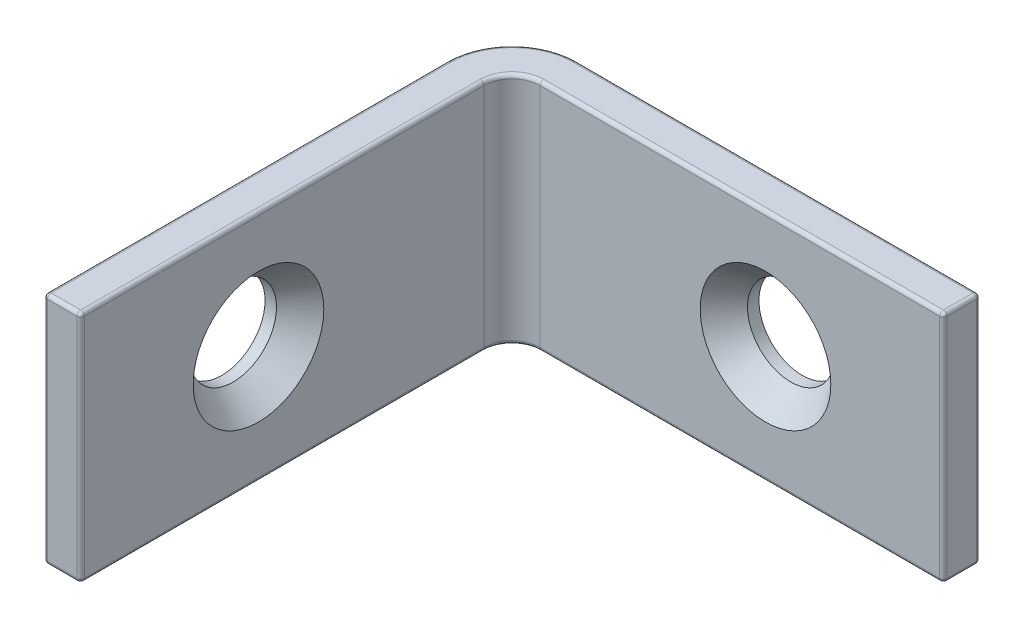
ISO-10303-21;
HEADER;
FILE_DESCRIPTION(('STEP AP214'),'2;1');
FILE_NAME('part.step','',(''),(''),'','','');
FILE_SCHEMA(('AUTOMOTIVE_DESIGN { 1 0 10303 214 1 1 1 1 }'));
ENDSEC;
DATA;
#1=APPLICATION_CONTEXT('core data for automotive mechanical design processes');
#2=APPLICATION_PROTOCOL_DEFINITION('international standard','automotive_design',2000,#1);
#3=PRODUCT_CONTEXT('',#1,'mechanical');
#4=PRODUCT('Part','Part','',(#3));
#5=PRODUCT_RELATED_PRODUCT_CATEGORY('part','',(#4));
#6=PRODUCT_DEFINITION_FORMATION('','',#4);
#7=PRODUCT_DEFINITION_CONTEXT('part definition',#1,'design');
#8=PRODUCT_DEFINITION('design','',#6,#7);
#9=PRODUCT_DEFINITION_SHAPE('','',#8);
#10=(LENGTH_UNIT() NAMED_UNIT(*) SI_UNIT(.MILLI.,.METRE.));
#11=(NAMED_UNIT(*) PLANE_ANGLE_UNIT() SI_UNIT($,.RADIAN.));
#12=(NAMED_UNIT(*) SI_UNIT($,.STERADIAN.) SOLID_ANGLE_UNIT());
#13=UNCERTAINTY_MEASURE_WITH_UNIT(LENGTH_MEASURE(1.E-05),#10,'distance_accuracy_value','');
#14=(GEOMETRIC_REPRESENTATION_CONTEXT(3) GLOBAL_UNCERTAINTY_ASSIGNED_CONTEXT((#13)) GLOBAL_UNIT_ASSIGNED_CONTEXT((#10,
#11,#12)) REPRESENTATION_CONTEXT('',''));
#15=CARTESIAN_POINT('',(0.,0.,0.));
#16=DIRECTION('',(0.,0.,1.));
#17=DIRECTION('',(1.,0.,0.));
#18=AXIS2_PLACEMENT_3D('',#15,#16,#17);
#19=CARTESIAN_POINT('',(-0.996949999999999,6.35,24.40305));
#20=DIRECTION('',(1.,0.,0.));
#21=DIRECTION('',(0.,0.,-1.));
#22=AXIS2_PLACEMENT_3D('',#19,#20,#21);
#23=PLANE('',#22);
#24=CARTESIAN_POINT('',(-0.996949999999999,0.,14.75105));
#25=DIRECTION('',(1.,0.,0.));
#26=DIRECTION('',(0.,0.,-1.));
#27=AXIS2_PLACEMENT_3D('',#24,#25,#26);
#28=CIRCLE('',#27,2.3495);
#29=CARTESIAN_POINT('',(-0.996949999999999,0.,12.40155));
#30=VERTEX_POINT('',#29);
#31=EDGE_CURVE('E1208',#30,#30,#28,.F.);
#32=ORIENTED_EDGE('',*,*,#31,.F.);
#33=EDGE_LOOP('',(#32));
#34=FACE_BOUND('',#33,.T.);
#35=DIRECTION('',(0.,-1.,0.));
#36=VECTOR('',#35,1.);
#37=CARTESIAN_POINT('',(-0.996949999999999,6.35,2.52095));
#38=LINE('',#37,#36);
#39=CARTESIAN_POINT('',(-0.996949999999999,6.15061,2.52095));
#40=VERTEX_POINT('',#39);
#41=CARTESIAN_POINT('',(-0.996949999999999,-6.15061,2.52095));
#42=VERTEX_POINT('',#41);
#43=EDGE_CURVE('E972',#40,#42,#38,.T.);
#44=ORIENTED_EDGE('',*,*,#43,.T.);
#45=DIRECTION('',(0.,0.,1.));
#46=VECTOR('',#45,1.);
#47=CARTESIAN_POINT('',(-0.996949999999999,-6.15061,24.40305));
#48=LINE('',#47,#46);
#49=CARTESIAN_POINT('',(-0.996949999999999,-6.15061,24.20366));
#50=VERTEX_POINT('',#49);
#51=EDGE_CURVE('E1019',#42,#50,#48,.T.);
#52=ORIENTED_EDGE('',*,*,#51,.T.);
#53=DIRECTION('',(0.,-1.,0.));
#54=VECTOR('',#53,1.);
#55=CARTESIAN_POINT('',(-0.996949999999999,6.35,24.20366));
#56=LINE('',#55,#54);
#57=CARTESIAN_POINT('',(-0.996949999999999,6.15061,24.20366));
#58=VERTEX_POINT('',#57);
#59=EDGE_CURVE('E1016',#50,#58,#56,.F.);
#60=ORIENTED_EDGE('',*,*,#59,.T.);
#61=DIRECTION('',(0.,0.,1.));
#62=VECTOR('',#61,1.);
#63=CARTESIAN_POINT('',(-0.996949999999999,6.15061,24.40305));
#64=LINE('',#63,#62);
#65=EDGE_CURVE('E1013',#58,#40,#64,.F.);
#66=ORIENTED_EDGE('',*,*,#65,.T.);
#67=EDGE_LOOP('',(#44,#52,#60,#66));
#68=FACE_BOUND('',#67,.T.);
#69=ADVANCED_FACE('F789',(#34,#68),#23,.F.);
#70=CARTESIAN_POINT('',(0.996949999999999,6.35,24.40305));
#71=DIRECTION('',(0.,0.,-1.));
#72=DIRECTION('',(-1.,0.,0.));
#73=AXIS2_PLACEMENT_3D('',#70,#71,#72);
#74=PLANE('',#73);
#75=DIRECTION('',(0.,-1.,0.));
#76=VECTOR('',#75,1.);
#77=CARTESIAN_POINT('',(-0.797559999999999,6.35,24.40305));
#78=LINE('',#77,#76);
#79=CARTESIAN_POINT('',(-0.797559999999999,6.15061,24.40305));
#80=VERTEX_POINT('',#79);
#81=CARTESIAN_POINT('',(-0.797559999999999,-6.15061,24.40305));
#82=VERTEX_POINT('',#81);
#83=EDGE_CURVE('E1006',#80,#82,#78,.T.);
#84=ORIENTED_EDGE('',*,*,#83,.T.);
#85=DIRECTION('',(1.,0.,0.));
#86=VECTOR('',#85,1.);
#87=CARTESIAN_POINT('',(0.996949999999999,-6.15061,24.40305));
#88=LINE('',#87,#86);
#89=CARTESIAN_POINT('',(0.797559999999998,-6.15061,24.40305));
#90=VERTEX_POINT('',#89);
#91=EDGE_CURVE('E1010',#82,#90,#88,.T.);
#92=ORIENTED_EDGE('',*,*,#91,.T.);
#93=DIRECTION('',(0.,-1.,0.));
#94=VECTOR('',#93,1.);
#95=CARTESIAN_POINT('',(0.797559999999998,6.35,24.40305));
#96=LINE('',#95,#94);
#97=CARTESIAN_POINT('',(0.797559999999998,6.15061,24.40305));
#98=VERTEX_POINT('',#97);
#99=EDGE_CURVE('E1003',#90,#98,#96,.F.);
#100=ORIENTED_EDGE('',*,*,#99,.T.);
#101=DIRECTION('',(1.,0.,0.));
#102=VECTOR('',#101,1.);
#103=CARTESIAN_POINT('',(0.996949999999999,6.15061,24.40305));
#104=LINE('',#103,#102);
#105=EDGE_CURVE('E1000',#98,#80,#104,.F.);
#106=ORIENTED_EDGE('',*,*,#105,.T.);
#107=EDGE_LOOP('',(#84,#92,#100,#106));
#108=FACE_BOUND('',#107,.T.);
#109=ADVANCED_FACE('F1254',(#108),#74,.F.);
#110=CARTESIAN_POINT('',(0.996949999999984,6.35,0.996950000000008));
#111=DIRECTION('',(-1.,0.,0.));
#112=DIRECTION('',(0.,0.,1.));
#113=AXIS2_PLACEMENT_3D('',#110,#111,#112);
#114=PLANE('',#113);
#115=CARTESIAN_POINT('',(0.996949999999992,0.,14.75105));
#116=DIRECTION('',(1.,0.,0.));
#117=DIRECTION('',(0.,0.,-1.));
#118=AXIS2_PLACEMENT_3D('',#115,#116,#117);
#119=CIRCLE('',#118,3.5433);
#120=CARTESIAN_POINT('',(0.99694999999999,0.,11.20775));
#121=VERTEX_POINT('',#120);
#122=EDGE_CURVE('E1196',#121,#121,#119,.T.);
#123=ORIENTED_EDGE('',*,*,#122,.F.);
#124=EDGE_LOOP('',(#123));
#125=FACE_BOUND('',#124,.T.);
#126=DIRECTION('',(0.,-1.,0.));
#127=VECTOR('',#126,1.);
#128=CARTESIAN_POINT('',(0.996949999999998,6.35,24.20366));
#129=LINE('',#128,#127);
#130=CARTESIAN_POINT('',(0.996949999999998,6.15061,24.20366));
#131=VERTEX_POINT('',#130);
#132=CARTESIAN_POINT('',(0.996949999999998,-6.15061,24.20366));
#133=VERTEX_POINT('',#132);
#134=EDGE_CURVE('E1025',#131,#133,#129,.T.);
#135=ORIENTED_EDGE('',*,*,#134,.T.);
#136=DIRECTION('',(0.,0.,-1.));
#137=VECTOR('',#136,1.);
#138=CARTESIAN_POINT('',(0.996949999999985,-6.15061,2.52095000000001));
#139=LINE('',#138,#137);
#140=CARTESIAN_POINT('',(0.996949999999985,-6.15061,2.52095000000001));
#141=VERTEX_POINT('',#140);
#142=EDGE_CURVE('E1028',#133,#141,#139,.T.);
#143=ORIENTED_EDGE('',*,*,#142,.T.);
#144=DIRECTION('',(0.,-1.,0.));
#145=VECTOR('',#144,1.);
#146=CARTESIAN_POINT('',(0.996949999999985,6.35,2.52095000000001));
#147=LINE('',#146,#145);
#148=CARTESIAN_POINT('',(0.996949999999985,6.15061,2.52095000000001));
#149=VERTEX_POINT('',#148);
#150=EDGE_CURVE('E1226',#141,#149,#147,.F.);
#151=ORIENTED_EDGE('',*,*,#150,.T.);
#152=DIRECTION('',(0.,0.,-1.));
#153=VECTOR('',#152,1.);
#154=CARTESIAN_POINT('',(0.996949999999984,6.15061,0.996950000000008));
#155=LINE('',#154,#153);
#156=EDGE_CURVE('E1022',#149,#131,#155,.F.);
#157=ORIENTED_EDGE('',*,*,#156,.T.);
#158=EDGE_LOOP('',(#135,#143,#151,#157));
#159=FACE_BOUND('',#158,.T.);
#160=ADVANCED_FACE('F1260',(#125,#159),#114,.F.);
#161=CARTESIAN_POINT('',(24.40305,6.35,0.996950000000001));
#162=DIRECTION('',(0.,0.,-1.));
#163=DIRECTION('',(-1.,0.,0.));
#164=AXIS2_PLACEMENT_3D('',#161,#162,#163);
#165=PLANE('',#164);
#166=CARTESIAN_POINT('',(14.75105,0.,0.996950000000009));
#167=DIRECTION('',(0.,0.,1.));
#168=DIRECTION('',(1.,0.,0.));
#169=AXIS2_PLACEMENT_3D('',#166,#167,#168);
#170=CIRCLE('',#169,3.5433);
#171=CARTESIAN_POINT('',(18.29435,0.,0.996950000000009));
#172=VERTEX_POINT('',#171);
#173=EDGE_CURVE('E1213',#172,#172,#170,.T.);
#174=ORIENTED_EDGE('',*,*,#173,.F.);
#175=EDGE_LOOP('',(#174));
#176=FACE_BOUND('',#175,.T.);
#177=DIRECTION('',(0.,-1.,0.));
#178=VECTOR('',#177,1.);
#179=CARTESIAN_POINT('',(2.52094999999998,-6.35,0.996950000000008));
#180=LINE('',#179,#178);
#181=CARTESIAN_POINT('',(2.52094999999998,6.15061,0.996950000000008));
#182=VERTEX_POINT('',#181);
#183=CARTESIAN_POINT('',(2.52094999999998,-6.15061,0.996950000000008));
#184=VERTEX_POINT('',#183);
#185=EDGE_CURVE('E1222',#182,#184,#180,.T.);
#186=ORIENTED_EDGE('',*,*,#185,.T.);
#187=DIRECTION('',(1.,0.,0.));
#188=VECTOR('',#187,1.);
#189=CARTESIAN_POINT('',(24.40305,-6.15061,0.996950000000001));
#190=LINE('',#189,#188);
#191=CARTESIAN_POINT('',(24.20366,-6.15061,0.996950000000001));
#192=VERTEX_POINT('',#191);
#193=EDGE_CURVE('E989',#184,#192,#190,.T.);
#194=ORIENTED_EDGE('',*,*,#193,.T.);
#195=DIRECTION('',(0.,-1.,0.));
#196=VECTOR('',#195,1.);
#197=CARTESIAN_POINT('',(24.20366,6.35,0.996950000000001));
#198=LINE('',#197,#196);
#199=CARTESIAN_POINT('',(24.20366,6.15061,0.996950000000001));
#200=VERTEX_POINT('',#199);
#201=EDGE_CURVE('E985',#192,#200,#198,.F.);
#202=ORIENTED_EDGE('',*,*,#201,.T.);
#203=DIRECTION('',(1.,0.,0.));
#204=VECTOR('',#203,1.);
#205=CARTESIAN_POINT('',(24.40305,6.15061,0.996950000000001));
#206=LINE('',#205,#204);
#207=EDGE_CURVE('E982',#200,#182,#206,.F.);
#208=ORIENTED_EDGE('',*,*,#207,.T.);
#209=EDGE_LOOP('',(#186,#194,#202,#208));
#210=FACE_BOUND('',#209,.T.);
#211=ADVANCED_FACE('F1424',(#176,#210),#165,.F.);
#212=CARTESIAN_POINT('',(24.40305,6.35,0.996950000000001));
#213=DIRECTION('',(-1.,0.,0.));
#214=DIRECTION('',(0.,0.,1.));
#215=AXIS2_PLACEMENT_3D('',#212,#213,#214);
#216=PLANE('',#215);
#217=DIRECTION('',(0.,-1.,0.));
#218=VECTOR('',#217,1.);
#219=CARTESIAN_POINT('',(24.40305,6.35,0.797560000000001));
#220=LINE('',#219,#218);
#221=CARTESIAN_POINT('',(24.40305,6.15061,0.797560000000001));
#222=VERTEX_POINT('',#221);
#223=CARTESIAN_POINT('',(24.40305,-6.15061,0.797560000000001));
#224=VERTEX_POINT('',#223);
#225=EDGE_CURVE('E939',#222,#224,#220,.T.);
#226=ORIENTED_EDGE('',*,*,#225,.T.);
#227=DIRECTION('',(0.,0.,-1.));
#228=VECTOR('',#227,1.);
#229=CARTESIAN_POINT('',(24.40305,-6.15061,-0.996950000000001));
#230=LINE('',#229,#228);
#231=CARTESIAN_POINT('',(24.40305,-6.15061,-0.797560000000001));
#232=VERTEX_POINT('',#231);
#233=EDGE_CURVE('E934',#224,#232,#230,.T.);
#234=ORIENTED_EDGE('',*,*,#233,.T.);
#235=DIRECTION('',(0.,-1.,0.));
#236=VECTOR('',#235,1.);
#237=CARTESIAN_POINT('',(24.40305,6.35,-0.797560000000001));
#238=LINE('',#237,#236);
#239=CARTESIAN_POINT('',(24.40305,6.15061,-0.797560000000001));
#240=VERTEX_POINT('',#239);
#241=EDGE_CURVE('E926',#232,#240,#238,.F.);
#242=ORIENTED_EDGE('',*,*,#241,.T.);
#243=DIRECTION('',(0.,0.,-1.));
#244=VECTOR('',#243,1.);
#245=CARTESIAN_POINT('',(24.40305,6.15061,0.996950000000001));
#246=LINE('',#245,#244);
#247=EDGE_CURVE('E931',#240,#222,#246,.F.);
#248=ORIENTED_EDGE('',*,*,#247,.T.);
#249=EDGE_LOOP('',(#226,#234,#242,#248));
#250=FACE_BOUND('',#249,.T.);
#251=ADVANCED_FACE('F929',(#250),#216,.F.);
#252=CARTESIAN_POINT('',(-0.996949999999999,6.35,-0.996950000000001));
#253=DIRECTION('',(0.,0.,1.));
#254=DIRECTION('',(1.,0.,0.));
#255=AXIS2_PLACEMENT_3D('',#252,#253,#254);
#256=PLANE('',#255);
#257=CARTESIAN_POINT('',(14.75105,0.,-0.996950000000001));
#258=DIRECTION('',(0.,0.,1.));
#259=DIRECTION('',(1.,0.,0.));
#260=AXIS2_PLACEMENT_3D('',#257,#258,#259);
#261=CIRCLE('',#260,2.3495);
#262=CARTESIAN_POINT('',(17.10055,0.,-0.996950000000001));
#263=VERTEX_POINT('',#262);
#264=EDGE_CURVE('E1218',#263,#263,#261,.F.);
#265=ORIENTED_EDGE('',*,*,#264,.F.);
#266=EDGE_LOOP('',(#265));
#267=FACE_BOUND('',#266,.T.);
#268=DIRECTION('',(0.,-1.,0.));
#269=VECTOR('',#268,1.);
#270=CARTESIAN_POINT('',(24.20366,6.35,-0.996950000000001));
#271=LINE('',#270,#269);
#272=CARTESIAN_POINT('',(24.20366,6.15061,-0.996950000000001));
#273=VERTEX_POINT('',#272);
#274=CARTESIAN_POINT('',(24.20366,-6.15061,-0.996950000000001));
#275=VERTEX_POINT('',#274);
#276=EDGE_CURVE('E947',#273,#275,#271,.T.);
#277=ORIENTED_EDGE('',*,*,#276,.T.);
#278=DIRECTION('',(-1.,0.,0.));
#279=VECTOR('',#278,1.);
#280=CARTESIAN_POINT('',(2.52095,-6.15061,-0.996950000000001));
#281=LINE('',#280,#279);
#282=CARTESIAN_POINT('',(2.52095,-6.15061,-0.996950000000001));
#283=VERTEX_POINT('',#282);
#284=EDGE_CURVE('E997',#275,#283,#281,.T.);
#285=ORIENTED_EDGE('',*,*,#284,.T.);
#286=DIRECTION('',(0.,-1.,0.));
#287=VECTOR('',#286,1.);
#288=CARTESIAN_POINT('',(2.52095,6.35,-0.996950000000001));
#289=LINE('',#288,#287);
#290=CARTESIAN_POINT('',(2.52095,6.15061,-0.996950000000001));
#291=VERTEX_POINT('',#290);
#292=EDGE_CURVE('E968',#283,#291,#289,.F.);
#293=ORIENTED_EDGE('',*,*,#292,.T.);
#294=DIRECTION('',(-1.,0.,0.));
#295=VECTOR('',#294,1.);
#296=CARTESIAN_POINT('',(-0.996949999999999,6.15061,-0.996950000000001));
#297=LINE('',#296,#295);
#298=EDGE_CURVE('E992',#291,#273,#297,.F.);
#299=ORIENTED_EDGE('',*,*,#298,.T.);
#300=EDGE_LOOP('',(#277,#285,#293,#299));
#301=FACE_BOUND('',#300,.T.);
#302=ADVANCED_FACE('F1415',(#267,#301),#256,.F.);
#303=CARTESIAN_POINT('',(0.,6.35,0.));
#304=DIRECTION('',(0.,-1.,0.));
#305=DIRECTION('',(0.,0.,-1.));
#306=AXIS2_PLACEMENT_3D('',#303,#304,#305);
#307=PLANE('',#306);
#308=DIRECTION('',(1.,0.,0.));
#309=VECTOR('',#308,1.);
#310=CARTESIAN_POINT('',(0.,6.35,0.797560000000009));
#311=LINE('',#310,#309);
#312=CARTESIAN_POINT('',(2.52094999999998,6.35,0.797560000000008));
#313=VERTEX_POINT('',#312);
#314=CARTESIAN_POINT('',(24.20366,6.35,0.797560000000001));
#315=VERTEX_POINT('',#314);
#316=EDGE_CURVE('E799',#313,#315,#311,.T.);
#317=ORIENTED_EDGE('',*,*,#316,.T.);
#318=DIRECTION('',(0.,0.,-1.));
#319=VECTOR('',#318,1.);
#320=CARTESIAN_POINT('',(24.20366,6.35,0.));
#321=LINE('',#320,#319);
#322=CARTESIAN_POINT('',(24.20366,6.35,-0.797560000000001));
#323=VERTEX_POINT('',#322);
#324=EDGE_CURVE('E12',#315,#323,#321,.T.);
#325=ORIENTED_EDGE('',*,*,#324,.T.);
#326=DIRECTION('',(-1.,0.,0.));
#327=VECTOR('',#326,1.);
#328=CARTESIAN_POINT('',(0.,6.35,-0.797560000000001));
#329=LINE('',#328,#327);
#330=CARTESIAN_POINT('',(2.52095,6.35,-0.797560000000001));
#331=VERTEX_POINT('',#330);
#332=EDGE_CURVE('E1068',#323,#331,#329,.T.);
#333=ORIENTED_EDGE('',*,*,#332,.T.);
#334=CARTESIAN_POINT('',(2.52095,6.35,2.52095));
#335=DIRECTION('',(0.,-1.,0.));
#336=DIRECTION('',(0.,0.,-1.));
#337=AXIS2_PLACEMENT_3D('',#334,#335,#336);
#338=CIRCLE('',#337,3.31851);
#339=CARTESIAN_POINT('',(-0.797559999999999,6.35,2.52095));
#340=VERTEX_POINT('',#339);
#341=EDGE_CURVE('E1071',#331,#340,#338,.F.);
#342=ORIENTED_EDGE('',*,*,#341,.T.);
#343=DIRECTION('',(0.,0.,1.));
#344=VECTOR('',#343,1.);
#345=CARTESIAN_POINT('',(-0.797559999999999,6.35,0.));
#346=LINE('',#345,#344);
#347=CARTESIAN_POINT('',(-0.797559999999999,6.35,24.20366));
#348=VERTEX_POINT('',#347);
#349=EDGE_CURVE('E1074',#340,#348,#346,.T.);
#350=ORIENTED_EDGE('',*,*,#349,.T.);
#351=DIRECTION('',(1.,0.,0.));
#352=VECTOR('',#351,1.);
#353=CARTESIAN_POINT('',(0.,6.35,24.20366));
#354=LINE('',#353,#352);
#355=CARTESIAN_POINT('',(0.797559999999998,6.35,24.20366));
#356=VERTEX_POINT('',#355);
#357=EDGE_CURVE('E1077',#348,#356,#354,.T.);
#358=ORIENTED_EDGE('',*,*,#357,.T.);
#359=DIRECTION('',(0.,0.,-1.));
#360=VECTOR('',#359,1.);
#361=CARTESIAN_POINT('',(0.797559999999983,6.35,0.));
#362=LINE('',#361,#360);
#363=CARTESIAN_POINT('',(0.797559999999985,6.35,2.52095000000001));
#364=VERTEX_POINT('',#363);
#365=EDGE_CURVE('E1080',#356,#364,#362,.T.);
#366=ORIENTED_EDGE('',*,*,#365,.T.);
#367=CARTESIAN_POINT('',(2.52094999999998,6.35,2.52095000000001));
#368=DIRECTION('',(0.,-1.,0.));
#369=DIRECTION('',(0.,0.,-1.));
#370=AXIS2_PLACEMENT_3D('',#367,#368,#369);
#371=CIRCLE('',#370,1.72339);
#372=EDGE_CURVE('E810',#364,#313,#371,.T.);
#373=ORIENTED_EDGE('',*,*,#372,.T.);
#374=EDGE_LOOP('',(#317,#325,#333,#342,#350,#358,#366,#373));
#375=FACE_BOUND('',#374,.T.);
#376=ADVANCED_FACE('F1410',(#375),#307,.F.);
#377=CARTESIAN_POINT('',(0.,-6.35,0.));
#378=DIRECTION('',(0.,-1.,0.));
#379=DIRECTION('',(0.,0.,-1.));
#380=AXIS2_PLACEMENT_3D('',#377,#378,#379);
#381=PLANE('',#380);
#382=DIRECTION('',(0.,0.,-1.));
#383=VECTOR('',#382,1.);
#384=CARTESIAN_POINT('',(0.797559999999999,-6.35,24.40305));
#385=LINE('',#384,#383);
#386=CARTESIAN_POINT('',(0.797559999999984,-6.35,2.52095000000001));
#387=VERTEX_POINT('',#386);
#388=CARTESIAN_POINT('',(0.797559999999998,-6.35,24.20366));
#389=VERTEX_POINT('',#388);
#390=EDGE_CURVE('E1049',#387,#389,#385,.F.);
#391=ORIENTED_EDGE('',*,*,#390,.T.);
#392=DIRECTION('',(1.,0.,0.));
#393=VECTOR('',#392,1.);
#394=CARTESIAN_POINT('',(-0.996949999999999,-6.35,24.20366));
#395=LINE('',#394,#393);
#396=CARTESIAN_POINT('',(-0.797559999999999,-6.35,24.20366));
#397=VERTEX_POINT('',#396);
#398=EDGE_CURVE('E1052',#389,#397,#395,.F.);
#399=ORIENTED_EDGE('',*,*,#398,.T.);
#400=DIRECTION('',(0.,0.,1.));
#401=VECTOR('',#400,1.);
#402=CARTESIAN_POINT('',(-0.797559999999999,-6.35,2.52095000000001));
#403=LINE('',#402,#401);
#404=CARTESIAN_POINT('',(-0.797559999999999,-6.35,2.52095));
#405=VERTEX_POINT('',#404);
#406=EDGE_CURVE('E1031',#397,#405,#403,.F.);
#407=ORIENTED_EDGE('',*,*,#406,.T.);
#408=CARTESIAN_POINT('',(2.52095,-6.35,2.52095));
#409=DIRECTION('',(0.,-1.,0.));
#410=DIRECTION('',(0.,0.,-1.));
#411=AXIS2_PLACEMENT_3D('',#408,#409,#410);
#412=CIRCLE('',#411,3.31851);
#413=CARTESIAN_POINT('',(2.52095,-6.35,-0.797559999999999));
#414=VERTEX_POINT('',#413);
#415=EDGE_CURVE('E1034',#405,#414,#412,.T.);
#416=ORIENTED_EDGE('',*,*,#415,.T.);
#417=DIRECTION('',(-1.,0.,0.));
#418=VECTOR('',#417,1.);
#419=CARTESIAN_POINT('',(24.40305,-6.35,-0.797560000000001));
#420=LINE('',#419,#418);
#421=CARTESIAN_POINT('',(24.20366,-6.35,-0.797560000000001));
#422=VERTEX_POINT('',#421);
#423=EDGE_CURVE('E1037',#414,#422,#420,.F.);
#424=ORIENTED_EDGE('',*,*,#423,.T.);
#425=DIRECTION('',(0.,0.,-1.));
#426=VECTOR('',#425,1.);
#427=CARTESIAN_POINT('',(24.20366,-6.35,0.996950000000001));
#428=LINE('',#427,#426);
#429=CARTESIAN_POINT('',(24.20366,-6.35,0.797560000000001));
#430=VERTEX_POINT('',#429);
#431=EDGE_CURVE('E1040',#422,#430,#428,.F.);
#432=ORIENTED_EDGE('',*,*,#431,.T.);
#433=DIRECTION('',(1.,0.,0.));
#434=VECTOR('',#433,1.);
#435=CARTESIAN_POINT('',(2.52094999999998,-6.35,0.797560000000008));
#436=LINE('',#435,#434);
#437=CARTESIAN_POINT('',(2.52094999999998,-6.35,0.797560000000008));
#438=VERTEX_POINT('',#437);
#439=EDGE_CURVE('E1043',#430,#438,#436,.F.);
#440=ORIENTED_EDGE('',*,*,#439,.T.);
#441=CARTESIAN_POINT('',(2.52094999999998,-6.35,2.52095000000001));
#442=DIRECTION('',(0.,-1.,0.));
#443=DIRECTION('',(0.,0.,-1.));
#444=AXIS2_PLACEMENT_3D('',#441,#442,#443);
#445=CIRCLE('',#444,1.72339);
#446=EDGE_CURVE('E1046',#438,#387,#445,.F.);
#447=ORIENTED_EDGE('',*,*,#446,.T.);
#448=EDGE_LOOP('',(#391,#399,#407,#416,#424,#432,#440,#447));
#449=FACE_BOUND('',#448,.T.);
#450=ADVANCED_FACE('F1270',(#449),#381,.T.);
#451=CARTESIAN_POINT('',(2.52094999999998,6.35,2.52095000000001));
#452=DIRECTION('',(0.,1.,0.));
#453=DIRECTION('',(0.,0.,1.));
#454=AXIS2_PLACEMENT_3D('',#451,#452,#453);
#455=CYLINDRICAL_SURFACE('',#454,1.524);
#456=ORIENTED_EDGE('',*,*,#150,.F.);
#457=CARTESIAN_POINT('',(2.52094999999998,-6.15061,2.52095000000001));
#458=DIRECTION('',(0.,-1.,0.));
#459=DIRECTION('',(0.,0.,-1.));
#460=AXIS2_PLACEMENT_3D('',#457,#458,#459);
#461=CIRCLE('',#460,1.524);
#462=EDGE_CURVE('E1059',#141,#184,#461,.T.);
#463=ORIENTED_EDGE('',*,*,#462,.T.);
#464=ORIENTED_EDGE('',*,*,#185,.F.);
#465=CARTESIAN_POINT('',(2.52094999999998,6.15061,2.52095000000001));
#466=DIRECTION('',(0.,-1.,0.));
#467=DIRECTION('',(0.,0.,-1.));
#468=AXIS2_PLACEMENT_3D('',#465,#466,#467);
#469=CIRCLE('',#468,1.524);
#470=EDGE_CURVE('E1056',#182,#149,#469,.F.);
#471=ORIENTED_EDGE('',*,*,#470,.T.);
#472=EDGE_LOOP('',(#456,#463,#464,#471));
#473=FACE_BOUND('',#472,.T.);
#474=ADVANCED_FACE('F1267',(#473),#455,.F.);
#475=CARTESIAN_POINT('',(2.52095,6.35,2.52095));
#476=DIRECTION('',(0.,-1.,0.));
#477=DIRECTION('',(0.,0.,-1.));
#478=AXIS2_PLACEMENT_3D('',#475,#476,#477);
#479=CYLINDRICAL_SURFACE('',#478,3.5179);
#480=ORIENTED_EDGE('',*,*,#292,.F.);
#481=CARTESIAN_POINT('',(2.52095,-6.15061,2.52095));
#482=DIRECTION('',(0.,-1.,0.));
#483=DIRECTION('',(0.,0.,-1.));
#484=AXIS2_PLACEMENT_3D('',#481,#482,#483);
#485=CIRCLE('',#484,3.5179);
#486=EDGE_CURVE('E1065',#283,#42,#485,.F.);
#487=ORIENTED_EDGE('',*,*,#486,.T.);
#488=ORIENTED_EDGE('',*,*,#43,.F.);
#489=CARTESIAN_POINT('',(2.52095,6.15061,2.52095));
#490=DIRECTION('',(0.,-1.,0.));
#491=DIRECTION('',(0.,0.,-1.));
#492=AXIS2_PLACEMENT_3D('',#489,#490,#491);
#493=CIRCLE('',#492,3.5179);
#494=EDGE_CURVE('E1062',#40,#291,#493,.T.);
#495=ORIENTED_EDGE('',*,*,#494,.T.);
#496=EDGE_LOOP('',(#480,#487,#488,#495));
#497=FACE_BOUND('',#496,.T.);
#498=ADVANCED_FACE('F1251',(#497),#479,.T.);
#499=CARTESIAN_POINT('',(14.75105,0.,-0.997950000000001));
#500=DIRECTION('',(0.,0.,1.));
#501=DIRECTION('',(1.,0.,0.));
#502=AXIS2_PLACEMENT_3D('',#499,#500,#501);
#503=CYLINDRICAL_SURFACE('',#502,2.3495);
#504=CARTESIAN_POINT('',(14.75105,0.,-0.376359804540428));
#505=DIRECTION('',(0.,0.,1.));
#506=DIRECTION('',(1.,0.,0.));
#507=AXIS2_PLACEMENT_3D('',#504,#505,#506);
#508=CIRCLE('',#507,2.3495);
#509=CARTESIAN_POINT('',(17.10055,0.,-0.376359804540428));
#510=VERTEX_POINT('',#509);
#511=EDGE_CURVE('E1217',#510,#510,#508,.T.);
#512=ORIENTED_EDGE('',*,*,#511,.T.);
#513=EDGE_LOOP('',(#512));
#514=FACE_BOUND('',#513,.T.);
#515=ORIENTED_EDGE('',*,*,#264,.T.);
#516=EDGE_LOOP('',(#515));
#517=FACE_BOUND('',#516,.T.);
#518=ADVANCED_FACE('F1236',(#514,#517),#503,.F.);
#519=CARTESIAN_POINT('',(14.75105,0.,0.996950000000009));
#520=DIRECTION('',(0.,0.,1.));
#521=DIRECTION('',(1.,0.,0.));
#522=AXIS2_PLACEMENT_3D('',#519,#520,#521);
#523=CONICAL_SURFACE('',#522,3.5433,0.715584993317677);
#524=ORIENTED_EDGE('',*,*,#173,.T.);
#525=EDGE_LOOP('',(#524));
#526=FACE_BOUND('',#525,.T.);
#527=ORIENTED_EDGE('',*,*,#511,.F.);
#528=EDGE_LOOP('',(#527));
#529=FACE_BOUND('',#528,.T.);
#530=ADVANCED_FACE('F1239',(#526,#529),#523,.F.);
#531=CARTESIAN_POINT('',(-0.997950000000004,0.,14.75105));
#532=DIRECTION('',(1.,0.,0.));
#533=DIRECTION('',(0.,0.,-1.));
#534=AXIS2_PLACEMENT_3D('',#531,#532,#533);
#535=CYLINDRICAL_SURFACE('',#534,2.3495);
#536=CARTESIAN_POINT('',(-0.37635980454044,0.,14.75105));
#537=DIRECTION('',(1.,0.,0.));
#538=DIRECTION('',(0.,0.,-1.));
#539=AXIS2_PLACEMENT_3D('',#536,#537,#538);
#540=CIRCLE('',#539,2.3495);
#541=CARTESIAN_POINT('',(-0.376359804540442,0.,12.40155));
#542=VERTEX_POINT('',#541);
#543=EDGE_CURVE('E975',#542,#542,#540,.T.);
#544=ORIENTED_EDGE('',*,*,#543,.T.);
#545=EDGE_LOOP('',(#544));
#546=FACE_BOUND('',#545,.T.);
#547=ORIENTED_EDGE('',*,*,#31,.T.);
#548=EDGE_LOOP('',(#547));
#549=FACE_BOUND('',#548,.T.);
#550=ADVANCED_FACE('F1241',(#546,#549),#535,.F.);
#551=CARTESIAN_POINT('',(0.996949999999992,0.,14.75105));
#552=DIRECTION('',(1.,0.,0.));
#553=DIRECTION('',(0.,0.,-1.));
#554=AXIS2_PLACEMENT_3D('',#551,#552,#553);
#555=CONICAL_SURFACE('',#554,3.5433,0.715584993317677);
#556=ORIENTED_EDGE('',*,*,#122,.T.);
#557=EDGE_LOOP('',(#556));
#558=FACE_BOUND('',#557,.T.);
#559=ORIENTED_EDGE('',*,*,#543,.F.);
#560=EDGE_LOOP('',(#559));
#561=FACE_BOUND('',#560,.T.);
#562=ADVANCED_FACE('F1248',(#558,#561),#555,.F.);
#563=CARTESIAN_POINT('',(-0.797559999999999,6.35,24.20366));
#564=DIRECTION('',(0.,-1.,0.));
#565=DIRECTION('',(0.,0.,-1.));
#566=AXIS2_PLACEMENT_3D('',#563,#564,#565);
#567=CYLINDRICAL_SURFACE('',#566,0.19939);
#568=CARTESIAN_POINT('',(-0.797559999999999,6.15061,24.20366));
#569=DIRECTION('',(0.,1.,0.));
#570=DIRECTION('',(0.,0.,1.));
#571=AXIS2_PLACEMENT_3D('',#568,#569,#570);
#572=CIRCLE('',#571,0.19939);
#573=EDGE_CURVE('E793',#58,#80,#572,.T.);
#574=ORIENTED_EDGE('',*,*,#573,.F.);
#575=ORIENTED_EDGE('',*,*,#59,.F.);
#576=CARTESIAN_POINT('',(-0.797559999999999,-6.15061,24.20366));
#577=DIRECTION('',(0.,-1.,0.));
#578=DIRECTION('',(0.,0.,-1.));
#579=AXIS2_PLACEMENT_3D('',#576,#577,#578);
#580=CIRCLE('',#579,0.19939);
#581=EDGE_CURVE('E1187',#82,#50,#580,.T.);
#582=ORIENTED_EDGE('',*,*,#581,.F.);
#583=ORIENTED_EDGE('',*,*,#83,.F.);
#584=EDGE_LOOP('',(#574,#575,#582,#583));
#585=FACE_BOUND('',#584,.T.);
#586=ADVANCED_FACE('F791',(#585),#567,.T.);
#587=CARTESIAN_POINT('',(-0.797559999999999,6.15061,24.20366));
#588=DIRECTION('',(0.,0.,1.));
#589=DIRECTION('',(1.,0.,0.));
#590=AXIS2_PLACEMENT_3D('',#587,#588,#589);
#591=SPHERICAL_SURFACE('',#590,0.19939);
#592=CARTESIAN_POINT('',(-0.797559999999999,6.15061,24.20366));
#593=DIRECTION('',(0.,0.,1.));
#594=DIRECTION('',(1.,0.,0.));
#595=AXIS2_PLACEMENT_3D('',#592,#593,#594);
#596=CIRCLE('',#595,0.19939);
#597=EDGE_CURVE('E1180',#58,#348,#596,.F.);
#598=ORIENTED_EDGE('',*,*,#597,.F.);
#599=ORIENTED_EDGE('',*,*,#573,.T.);
#600=CARTESIAN_POINT('',(-0.797559999999999,6.15061,24.20366));
#601=DIRECTION('',(-1.,0.,0.));
#602=DIRECTION('',(0.,0.,1.));
#603=AXIS2_PLACEMENT_3D('',#600,#601,#602);
#604=CIRCLE('',#603,0.19939);
#605=EDGE_CURVE('E1184',#348,#80,#604,.F.);
#606=ORIENTED_EDGE('',*,*,#605,.F.);
#607=EDGE_LOOP('',(#598,#599,#606));
#608=FACE_BOUND('',#607,.T.);
#609=ADVANCED_FACE('F1371',(#608),#591,.T.);
#610=CARTESIAN_POINT('',(-0.797559999999999,-6.15061,24.20366));
#611=DIRECTION('',(0.,0.,1.));
#612=DIRECTION('',(1.,0.,0.));
#613=AXIS2_PLACEMENT_3D('',#610,#611,#612);
#614=SPHERICAL_SURFACE('',#613,0.19939);
#615=CARTESIAN_POINT('',(-0.797559999999999,-6.15061,24.20366));
#616=DIRECTION('',(-1.,0.,0.));
#617=DIRECTION('',(0.,0.,1.));
#618=AXIS2_PLACEMENT_3D('',#615,#616,#617);
#619=CIRCLE('',#618,0.19939);
#620=EDGE_CURVE('E1172',#82,#397,#619,.F.);
#621=ORIENTED_EDGE('',*,*,#620,.F.);
#622=ORIENTED_EDGE('',*,*,#581,.T.);
#623=CARTESIAN_POINT('',(-0.797559999999999,-6.15061,24.20366));
#624=DIRECTION('',(0.,0.,1.));
#625=DIRECTION('',(1.,0.,0.));
#626=AXIS2_PLACEMENT_3D('',#623,#624,#625);
#627=CIRCLE('',#626,0.19939);
#628=EDGE_CURVE('E1176',#397,#50,#627,.F.);
#629=ORIENTED_EDGE('',*,*,#628,.F.);
#630=EDGE_LOOP('',(#621,#622,#629));
#631=FACE_BOUND('',#630,.T.);
#632=ADVANCED_FACE('F1368',(#631),#614,.T.);
#633=CARTESIAN_POINT('',(0.,6.15061,24.20366));
#634=DIRECTION('',(1.,0.,0.));
#635=DIRECTION('',(0.,0.,-1.));
#636=AXIS2_PLACEMENT_3D('',#633,#634,#635);
#637=CYLINDRICAL_SURFACE('',#636,0.19939);
#638=ORIENTED_EDGE('',*,*,#605,.T.);
#639=ORIENTED_EDGE('',*,*,#105,.F.);
#640=CARTESIAN_POINT('',(0.797559999999998,6.15061,24.20366));
#641=DIRECTION('',(1.,0.,0.));
#642=DIRECTION('',(0.,0.,-1.));
#643=AXIS2_PLACEMENT_3D('',#640,#641,#642);
#644=CIRCLE('',#643,0.19939);
#645=EDGE_CURVE('E1164',#356,#98,#644,.T.);
#646=ORIENTED_EDGE('',*,*,#645,.F.);
#647=ORIENTED_EDGE('',*,*,#357,.F.);
#648=EDGE_LOOP('',(#638,#639,#646,#647));
#649=FACE_BOUND('',#648,.T.);
#650=ADVANCED_FACE('F1364',(#649),#637,.T.);
#651=CARTESIAN_POINT('',(-0.797559999999999,6.15061,0.));
#652=DIRECTION('',(0.,0.,1.));
#653=DIRECTION('',(1.,0.,0.));
#654=AXIS2_PLACEMENT_3D('',#651,#652,#653);
#655=CYLINDRICAL_SURFACE('',#654,0.19939);
#656=ORIENTED_EDGE('',*,*,#597,.T.);
#657=ORIENTED_EDGE('',*,*,#349,.F.);
#658=CARTESIAN_POINT('',(-0.797559999999999,6.15061,2.52095));
#659=DIRECTION('',(0.,0.,-1.));
#660=DIRECTION('',(-1.,0.,0.));
#661=AXIS2_PLACEMENT_3D('',#658,#659,#660);
#662=CIRCLE('',#661,0.19939);
#663=EDGE_CURVE('E1160',#40,#340,#662,.T.);
#664=ORIENTED_EDGE('',*,*,#663,.F.);
#665=ORIENTED_EDGE('',*,*,#65,.F.);
#666=EDGE_LOOP('',(#656,#657,#664,#665));
#667=FACE_BOUND('',#666,.T.);
#668=ADVANCED_FACE('F1360',(#667),#655,.T.);
#669=CARTESIAN_POINT('',(-0.797559999999999,-6.15061,24.40305));
#670=DIRECTION('',(0.,0.,-1.));
#671=DIRECTION('',(-1.,0.,0.));
#672=AXIS2_PLACEMENT_3D('',#669,#670,#671);
#673=CYLINDRICAL_SURFACE('',#672,0.19939);
#674=ORIENTED_EDGE('',*,*,#628,.T.);
#675=ORIENTED_EDGE('',*,*,#51,.F.);
#676=CARTESIAN_POINT('',(-0.797559999999999,-6.15061,2.52095));
#677=DIRECTION('',(0.,0.,-1.));
#678=DIRECTION('',(-1.,0.,0.));
#679=AXIS2_PLACEMENT_3D('',#676,#677,#678);
#680=CIRCLE('',#679,0.19939);
#681=EDGE_CURVE('E1156',#405,#42,#680,.T.);
#682=ORIENTED_EDGE('',*,*,#681,.F.);
#683=ORIENTED_EDGE('',*,*,#406,.F.);
#684=EDGE_LOOP('',(#674,#675,#682,#683));
#685=FACE_BOUND('',#684,.T.);
#686=ADVANCED_FACE('F1356',(#685),#673,.T.);
#687=CARTESIAN_POINT('',(0.996949999999999,-6.15061,24.20366));
#688=DIRECTION('',(-1.,0.,0.));
#689=DIRECTION('',(0.,0.,1.));
#690=AXIS2_PLACEMENT_3D('',#687,#688,#689);
#691=CYLINDRICAL_SURFACE('',#690,0.19939);
#692=ORIENTED_EDGE('',*,*,#620,.T.);
#693=ORIENTED_EDGE('',*,*,#398,.F.);
#694=CARTESIAN_POINT('',(0.797559999999998,-6.15061,24.20366));
#695=DIRECTION('',(1.,0.,0.));
#696=DIRECTION('',(0.,0.,-1.));
#697=AXIS2_PLACEMENT_3D('',#694,#695,#696);
#698=CIRCLE('',#697,0.19939);
#699=EDGE_CURVE('E1152',#90,#389,#698,.T.);
#700=ORIENTED_EDGE('',*,*,#699,.F.);
#701=ORIENTED_EDGE('',*,*,#91,.F.);
#702=EDGE_LOOP('',(#692,#693,#700,#701));
#703=FACE_BOUND('',#702,.T.);
#704=ADVANCED_FACE('F1352',(#703),#691,.T.);
#705=CARTESIAN_POINT('',(0.797559999999998,6.35,24.20366));
#706=DIRECTION('',(0.,-1.,0.));
#707=DIRECTION('',(0.,0.,-1.));
#708=AXIS2_PLACEMENT_3D('',#705,#706,#707);
#709=CYLINDRICAL_SURFACE('',#708,0.19939);
#710=CARTESIAN_POINT('',(0.797559999999998,6.15061,24.20366));
#711=DIRECTION('',(0.,1.,0.));
#712=DIRECTION('',(0.,0.,1.));
#713=AXIS2_PLACEMENT_3D('',#710,#711,#712);
#714=CIRCLE('',#713,0.19939);
#715=EDGE_CURVE('E1168',#98,#131,#714,.T.);
#716=ORIENTED_EDGE('',*,*,#715,.F.);
#717=ORIENTED_EDGE('',*,*,#99,.F.);
#718=CARTESIAN_POINT('',(0.797559999999998,-6.15061,24.20366));
#719=DIRECTION('',(0.,-1.,0.));
#720=DIRECTION('',(0.,0.,-1.));
#721=AXIS2_PLACEMENT_3D('',#718,#719,#720);
#722=CIRCLE('',#721,0.19939);
#723=EDGE_CURVE('E1148',#133,#90,#722,.T.);
#724=ORIENTED_EDGE('',*,*,#723,.F.);
#725=ORIENTED_EDGE('',*,*,#134,.F.);
#726=EDGE_LOOP('',(#716,#717,#724,#725));
#727=FACE_BOUND('',#726,.T.);
#728=ADVANCED_FACE('F1348',(#727),#709,.T.);
#729=CARTESIAN_POINT('',(0.797559999999998,6.15061,24.20366));
#730=DIRECTION('',(0.,0.,1.));
#731=DIRECTION('',(1.,0.,0.));
#732=AXIS2_PLACEMENT_3D('',#729,#730,#731);
#733=SPHERICAL_SURFACE('',#732,0.19939);
#734=ORIENTED_EDGE('',*,*,#645,.T.);
#735=ORIENTED_EDGE('',*,*,#715,.T.);
#736=CARTESIAN_POINT('',(0.797559999999998,6.15061,24.20366));
#737=DIRECTION('',(0.,0.,1.));
#738=DIRECTION('',(1.,0.,0.));
#739=AXIS2_PLACEMENT_3D('',#736,#737,#738);
#740=CIRCLE('',#739,0.19939);
#741=EDGE_CURVE('E1144',#356,#131,#740,.F.);
#742=ORIENTED_EDGE('',*,*,#741,.F.);
#743=EDGE_LOOP('',(#734,#735,#742));
#744=FACE_BOUND('',#743,.T.);
#745=ADVANCED_FACE('F1344',(#744),#733,.T.);
#746=CARTESIAN_POINT('',(2.52095,6.15061,2.52095));
#747=DIRECTION('',(0.,-1.,0.));
#748=DIRECTION('',(0.,0.,-1.));
#749=AXIS2_PLACEMENT_3D('',#746,#747,#748);
#750=TOROIDAL_SURFACE('',#749,3.31851,0.19939);
#751=ORIENTED_EDGE('',*,*,#663,.T.);
#752=ORIENTED_EDGE('',*,*,#341,.F.);
#753=CARTESIAN_POINT('',(2.52095,6.15061,-0.797559999999999));
#754=DIRECTION('',(1.,0.,0.));
#755=DIRECTION('',(0.,0.,-1.));
#756=AXIS2_PLACEMENT_3D('',#753,#754,#755);
#757=CIRCLE('',#756,0.19939);
#758=EDGE_CURVE('E1140',#291,#331,#757,.T.);
#759=ORIENTED_EDGE('',*,*,#758,.F.);
#760=ORIENTED_EDGE('',*,*,#494,.F.);
#761=EDGE_LOOP('',(#751,#752,#759,#760));
#762=FACE_BOUND('',#761,.T.);
#763=ADVANCED_FACE('F1340',(#762),#750,.T.);
#764=CARTESIAN_POINT('',(2.52095,-6.15061,2.52095));
#765=DIRECTION('',(0.,-1.,0.));
#766=DIRECTION('',(0.,0.,-1.));
#767=AXIS2_PLACEMENT_3D('',#764,#765,#766);
#768=TOROIDAL_SURFACE('',#767,3.31851,0.19939);
#769=ORIENTED_EDGE('',*,*,#681,.T.);
#770=ORIENTED_EDGE('',*,*,#486,.F.);
#771=CARTESIAN_POINT('',(2.52095,-6.15061,-0.797559999999999));
#772=DIRECTION('',(1.,0.,0.));
#773=DIRECTION('',(0.,0.,-1.));
#774=AXIS2_PLACEMENT_3D('',#771,#772,#773);
#775=CIRCLE('',#774,0.19939);
#776=EDGE_CURVE('E1136',#414,#283,#775,.T.);
#777=ORIENTED_EDGE('',*,*,#776,.F.);
#778=ORIENTED_EDGE('',*,*,#415,.F.);
#779=EDGE_LOOP('',(#769,#770,#777,#778));
#780=FACE_BOUND('',#779,.T.);
#781=ADVANCED_FACE('F1336',(#780),#768,.T.);
#782=CARTESIAN_POINT('',(0.797559999999998,-6.15061,24.20366));
#783=DIRECTION('',(0.,0.,1.));
#784=DIRECTION('',(1.,0.,0.));
#785=AXIS2_PLACEMENT_3D('',#782,#783,#784);
#786=SPHERICAL_SURFACE('',#785,0.19939);
#787=ORIENTED_EDGE('',*,*,#723,.T.);
#788=ORIENTED_EDGE('',*,*,#699,.T.);
#789=CARTESIAN_POINT('',(0.797559999999998,-6.15061,24.20366));
#790=DIRECTION('',(0.,0.,1.));
#791=DIRECTION('',(1.,0.,0.));
#792=AXIS2_PLACEMENT_3D('',#789,#790,#791);
#793=CIRCLE('',#792,0.19939);
#794=EDGE_CURVE('E1132',#133,#389,#793,.F.);
#795=ORIENTED_EDGE('',*,*,#794,.F.);
#796=EDGE_LOOP('',(#787,#788,#795));
#797=FACE_BOUND('',#796,.T.);
#798=ADVANCED_FACE('F1332',(#797),#786,.T.);
#799=CARTESIAN_POINT('',(0.797559999999983,6.15061,0.));
#800=DIRECTION('',(0.,0.,-1.));
#801=DIRECTION('',(-1.,0.,0.));
#802=AXIS2_PLACEMENT_3D('',#799,#800,#801);
#803=CYLINDRICAL_SURFACE('',#802,0.19939);
#804=ORIENTED_EDGE('',*,*,#741,.T.);
#805=ORIENTED_EDGE('',*,*,#156,.F.);
#806=CARTESIAN_POINT('',(0.797559999999985,6.15061,2.52095000000001));
#807=DIRECTION('',(0.,0.,-1.));
#808=DIRECTION('',(-1.,0.,0.));
#809=AXIS2_PLACEMENT_3D('',#806,#807,#808);
#810=CIRCLE('',#809,0.19939);
#811=EDGE_CURVE('E1128',#364,#149,#810,.T.);
#812=ORIENTED_EDGE('',*,*,#811,.F.);
#813=ORIENTED_EDGE('',*,*,#365,.F.);
#814=EDGE_LOOP('',(#804,#805,#812,#813));
#815=FACE_BOUND('',#814,.T.);
#816=ADVANCED_FACE('F1328',(#815),#803,.T.);
#817=CARTESIAN_POINT('',(0.,6.15061,-0.797560000000001));
#818=DIRECTION('',(-1.,0.,0.));
#819=DIRECTION('',(0.,0.,1.));
#820=AXIS2_PLACEMENT_3D('',#817,#818,#819);
#821=CYLINDRICAL_SURFACE('',#820,0.19939);
#822=ORIENTED_EDGE('',*,*,#758,.T.);
#823=ORIENTED_EDGE('',*,*,#332,.F.);
#824=CARTESIAN_POINT('',(24.20366,6.15061,-0.797560000000001));
#825=DIRECTION('',(1.,0.,0.));
#826=DIRECTION('',(0.,0.,-1.));
#827=AXIS2_PLACEMENT_3D('',#824,#825,#826);
#828=CIRCLE('',#827,0.19939);
#829=EDGE_CURVE('E952',#273,#323,#828,.T.);
#830=ORIENTED_EDGE('',*,*,#829,.F.);
#831=ORIENTED_EDGE('',*,*,#298,.F.);
#832=EDGE_LOOP('',(#822,#823,#830,#831));
#833=FACE_BOUND('',#832,.T.);
#834=ADVANCED_FACE('F1325',(#833),#821,.T.);
#835=CARTESIAN_POINT('',(24.20366,6.35,-0.797560000000001));
#836=DIRECTION('',(0.,-1.,0.));
#837=DIRECTION('',(0.,0.,-1.));
#838=AXIS2_PLACEMENT_3D('',#835,#836,#837);
#839=CYLINDRICAL_SURFACE('',#838,0.19939);
#840=CARTESIAN_POINT('',(24.20366,-6.15061,-0.797560000000001));
#841=DIRECTION('',(0.,-1.,0.));
#842=DIRECTION('',(0.,0.,-1.));
#843=AXIS2_PLACEMENT_3D('',#840,#841,#842);
#844=CIRCLE('',#843,0.19939);
#845=EDGE_CURVE('E953',#275,#232,#844,.T.);
#846=ORIENTED_EDGE('',*,*,#845,.F.);
#847=ORIENTED_EDGE('',*,*,#276,.F.);
#848=CARTESIAN_POINT('',(24.20366,6.15061,-0.797560000000001));
#849=DIRECTION('',(0.,1.,0.));
#850=DIRECTION('',(0.,0.,1.));
#851=AXIS2_PLACEMENT_3D('',#848,#849,#850);
#852=CIRCLE('',#851,0.19939);
#853=EDGE_CURVE('E943',#240,#273,#852,.T.);
#854=ORIENTED_EDGE('',*,*,#853,.F.);
#855=ORIENTED_EDGE('',*,*,#241,.F.);
#856=EDGE_LOOP('',(#846,#847,#854,#855));
#857=FACE_BOUND('',#856,.T.);
#858=ADVANCED_FACE('F945',(#857),#839,.T.);
#859=CARTESIAN_POINT('',(-0.996949999999999,-6.15061,-0.797560000000001));
#860=DIRECTION('',(1.,0.,0.));
#861=DIRECTION('',(0.,0.,-1.));
#862=AXIS2_PLACEMENT_3D('',#859,#860,#861);
#863=CYLINDRICAL_SURFACE('',#862,0.19939);
#864=ORIENTED_EDGE('',*,*,#776,.T.);
#865=ORIENTED_EDGE('',*,*,#284,.F.);
#866=CARTESIAN_POINT('',(24.20366,-6.15061,-0.797560000000001));
#867=DIRECTION('',(1.,0.,0.));
#868=DIRECTION('',(0.,0.,-1.));
#869=AXIS2_PLACEMENT_3D('',#866,#867,#868);
#870=CIRCLE('',#869,0.19939);
#871=EDGE_CURVE('E1121',#422,#275,#870,.T.);
#872=ORIENTED_EDGE('',*,*,#871,.F.);
#873=ORIENTED_EDGE('',*,*,#423,.F.);
#874=EDGE_LOOP('',(#864,#865,#872,#873));
#875=FACE_BOUND('',#874,.T.);
#876=ADVANCED_FACE('F1318',(#875),#863,.T.);
#877=CARTESIAN_POINT('',(0.797559999999984,-6.15061,0.996950000000009));
#878=DIRECTION('',(0.,0.,1.));
#879=DIRECTION('',(1.,0.,0.));
#880=AXIS2_PLACEMENT_3D('',#877,#878,#879);
#881=CYLINDRICAL_SURFACE('',#880,0.19939);
#882=ORIENTED_EDGE('',*,*,#794,.T.);
#883=ORIENTED_EDGE('',*,*,#390,.F.);
#884=CARTESIAN_POINT('',(0.797559999999985,-6.15061,2.52095000000001));
#885=DIRECTION('',(0.,0.,-1.));
#886=DIRECTION('',(-1.,0.,0.));
#887=AXIS2_PLACEMENT_3D('',#884,#885,#886);
#888=CIRCLE('',#887,0.19939);
#889=EDGE_CURVE('E1117',#141,#387,#888,.T.);
#890=ORIENTED_EDGE('',*,*,#889,.F.);
#891=ORIENTED_EDGE('',*,*,#142,.F.);
#892=EDGE_LOOP('',(#882,#883,#890,#891));
#893=FACE_BOUND('',#892,.T.);
#894=ADVANCED_FACE('F1314',(#893),#881,.T.);
#895=CARTESIAN_POINT('',(2.52094999999998,6.15061,2.52095000000001));
#896=DIRECTION('',(0.,-1.,0.));
#897=DIRECTION('',(0.,0.,-1.));
#898=AXIS2_PLACEMENT_3D('',#895,#896,#897);
#899=TOROIDAL_SURFACE('',#898,1.72339,0.19939);
#900=ORIENTED_EDGE('',*,*,#811,.T.);
#901=ORIENTED_EDGE('',*,*,#470,.F.);
#902=CARTESIAN_POINT('',(2.52094999999998,6.15061,0.797560000000008));
#903=DIRECTION('',(1.,0.,0.));
#904=DIRECTION('',(0.,0.,-1.));
#905=AXIS2_PLACEMENT_3D('',#902,#903,#904);
#906=CIRCLE('',#905,0.19939);
#907=EDGE_CURVE('E960',#313,#182,#906,.T.);
#908=ORIENTED_EDGE('',*,*,#907,.F.);
#909=ORIENTED_EDGE('',*,*,#372,.F.);
#910=EDGE_LOOP('',(#900,#901,#908,#909));
#911=FACE_BOUND('',#910,.T.);
#912=ADVANCED_FACE('F1311',(#911),#899,.T.);
#913=CARTESIAN_POINT('',(24.20366,6.15061,-0.797560000000001));
#914=DIRECTION('',(0.,0.,1.));
#915=DIRECTION('',(1.,0.,0.));
#916=AXIS2_PLACEMENT_3D('',#913,#914,#915);
#917=SPHERICAL_SURFACE('',#916,0.19939);
#918=ORIENTED_EDGE('',*,*,#853,.T.);
#919=ORIENTED_EDGE('',*,*,#829,.T.);
#920=CARTESIAN_POINT('',(24.20366,6.15061,-0.797560000000001));
#921=DIRECTION('',(0.,0.,-1.));
#922=DIRECTION('',(-1.,0.,0.));
#923=AXIS2_PLACEMENT_3D('',#920,#921,#922);
#924=CIRCLE('',#923,0.19939);
#925=EDGE_CURVE('E955',#240,#323,#924,.F.);
#926=ORIENTED_EDGE('',*,*,#925,.F.);
#927=EDGE_LOOP('',(#918,#919,#926));
#928=FACE_BOUND('',#927,.T.);
#929=ADVANCED_FACE('F956',(#928),#917,.T.);
#930=CARTESIAN_POINT('',(24.20366,-6.15061,-0.797560000000001));
#931=DIRECTION('',(0.,0.,1.));
#932=DIRECTION('',(1.,0.,0.));
#933=AXIS2_PLACEMENT_3D('',#930,#931,#932);
#934=SPHERICAL_SURFACE('',#933,0.19939);
#935=ORIENTED_EDGE('',*,*,#871,.T.);
#936=ORIENTED_EDGE('',*,*,#845,.T.);
#937=CARTESIAN_POINT('',(24.20366,-6.15061,-0.797560000000001));
#938=DIRECTION('',(0.,0.,-1.));
#939=DIRECTION('',(-1.,0.,0.));
#940=AXIS2_PLACEMENT_3D('',#937,#938,#939);
#941=CIRCLE('',#940,0.19939);
#942=EDGE_CURVE('E961',#422,#232,#941,.F.);
#943=ORIENTED_EDGE('',*,*,#942,.F.);
#944=EDGE_LOOP('',(#935,#936,#943));
#945=FACE_BOUND('',#944,.T.);
#946=ADVANCED_FACE('F1304',(#945),#934,.T.);
#947=CARTESIAN_POINT('',(2.52094999999998,-6.15061,2.52095000000001));
#948=DIRECTION('',(0.,-1.,0.));
#949=DIRECTION('',(0.,0.,-1.));
#950=AXIS2_PLACEMENT_3D('',#947,#948,#949);
#951=TOROIDAL_SURFACE('',#950,1.72339,0.19939);
#952=ORIENTED_EDGE('',*,*,#889,.T.);
#953=ORIENTED_EDGE('',*,*,#446,.F.);
#954=CARTESIAN_POINT('',(2.52094999999998,-6.15061,0.797560000000008));
#955=DIRECTION('',(1.,0.,0.));
#956=DIRECTION('',(0.,0.,-1.));
#957=AXIS2_PLACEMENT_3D('',#954,#955,#956);
#958=CIRCLE('',#957,0.19939);
#959=EDGE_CURVE('E1107',#184,#438,#958,.T.);
#960=ORIENTED_EDGE('',*,*,#959,.F.);
#961=ORIENTED_EDGE('',*,*,#462,.F.);
#962=EDGE_LOOP('',(#952,#953,#960,#961));
#963=FACE_BOUND('',#962,.T.);
#964=ADVANCED_FACE('F1300',(#963),#951,.T.);
#965=CARTESIAN_POINT('',(0.,6.15061,0.797560000000009));
#966=DIRECTION('',(1.,0.,0.));
#967=DIRECTION('',(0.,0.,-1.));
#968=AXIS2_PLACEMENT_3D('',#965,#966,#967);
#969=CYLINDRICAL_SURFACE('',#968,0.19939);
#970=ORIENTED_EDGE('',*,*,#907,.T.);
#971=ORIENTED_EDGE('',*,*,#207,.F.);
#972=CARTESIAN_POINT('',(24.20366,6.15061,0.797560000000001));
#973=DIRECTION('',(1.,0.,0.));
#974=DIRECTION('',(0.,0.,-1.));
#975=AXIS2_PLACEMENT_3D('',#972,#973,#974);
#976=CIRCLE('',#975,0.19939);
#977=EDGE_CURVE('E1103',#315,#200,#976,.T.);
#978=ORIENTED_EDGE('',*,*,#977,.F.);
#979=ORIENTED_EDGE('',*,*,#316,.F.);
#980=EDGE_LOOP('',(#970,#971,#978,#979));
#981=FACE_BOUND('',#980,.T.);
#982=ADVANCED_FACE('F1297',(#981),#969,.T.);
#983=CARTESIAN_POINT('',(24.20366,6.15061,0.));
#984=DIRECTION('',(0.,0.,-1.));
#985=DIRECTION('',(-1.,0.,0.));
#986=AXIS2_PLACEMENT_3D('',#983,#984,#985);
#987=CYLINDRICAL_SURFACE('',#986,0.19939);
#988=ORIENTED_EDGE('',*,*,#925,.T.);
#989=ORIENTED_EDGE('',*,*,#324,.F.);
#990=CARTESIAN_POINT('',(24.20366,6.15061,0.797560000000001));
#991=DIRECTION('',(0.,0.,1.));
#992=DIRECTION('',(0.,-1.,0.));
#993=AXIS2_PLACEMENT_3D('',#990,#991,#992);
#994=CIRCLE('',#993,0.19939);
#995=EDGE_CURVE('E965',#222,#315,#994,.T.);
#996=ORIENTED_EDGE('',*,*,#995,.F.);
#997=ORIENTED_EDGE('',*,*,#247,.F.);
#998=EDGE_LOOP('',(#988,#989,#996,#997));
#999=FACE_BOUND('',#998,.T.);
#1000=ADVANCED_FACE('F963',(#999),#987,.T.);
#1001=CARTESIAN_POINT('',(24.20366,-6.15061,0.996950000000001));
#1002=DIRECTION('',(0.,0.,1.));
#1003=DIRECTION('',(1.,0.,0.));
#1004=AXIS2_PLACEMENT_3D('',#1001,#1002,#1003);
#1005=CYLINDRICAL_SURFACE('',#1004,0.19939);
#1006=ORIENTED_EDGE('',*,*,#942,.T.);
#1007=ORIENTED_EDGE('',*,*,#233,.F.);
#1008=CARTESIAN_POINT('',(24.20366,-6.15061,0.797560000000001));
#1009=DIRECTION('',(0.,0.,1.));
#1010=DIRECTION('',(1.,0.,0.));
#1011=AXIS2_PLACEMENT_3D('',#1008,#1009,#1010);
#1012=CIRCLE('',#1011,0.19939);
#1013=EDGE_CURVE('E1097',#430,#224,#1012,.T.);
#1014=ORIENTED_EDGE('',*,*,#1013,.F.);
#1015=ORIENTED_EDGE('',*,*,#431,.F.);
#1016=EDGE_LOOP('',(#1006,#1007,#1014,#1015));
#1017=FACE_BOUND('',#1016,.T.);
#1018=ADVANCED_FACE('F1290',(#1017),#1005,.T.);
#1019=CARTESIAN_POINT('',(24.40305,-6.15061,0.797560000000001));
#1020=DIRECTION('',(-1.,0.,0.));
#1021=DIRECTION('',(0.,0.,1.));
#1022=AXIS2_PLACEMENT_3D('',#1019,#1020,#1021);
#1023=CYLINDRICAL_SURFACE('',#1022,0.19939);
#1024=ORIENTED_EDGE('',*,*,#959,.T.);
#1025=ORIENTED_EDGE('',*,*,#439,.F.);
#1026=CARTESIAN_POINT('',(24.20366,-6.15061,0.797560000000001));
#1027=DIRECTION('',(1.,0.,0.));
#1028=DIRECTION('',(0.,0.,-1.));
#1029=AXIS2_PLACEMENT_3D('',#1026,#1027,#1028);
#1030=CIRCLE('',#1029,0.19939);
#1031=EDGE_CURVE('E1093',#192,#430,#1030,.T.);
#1032=ORIENTED_EDGE('',*,*,#1031,.F.);
#1033=ORIENTED_EDGE('',*,*,#193,.F.);
#1034=EDGE_LOOP('',(#1024,#1025,#1032,#1033));
#1035=FACE_BOUND('',#1034,.T.);
#1036=ADVANCED_FACE('F1286',(#1035),#1023,.T.);
#1037=CARTESIAN_POINT('',(24.20366,6.15061,0.797560000000001));
#1038=DIRECTION('',(0.,0.,1.));
#1039=DIRECTION('',(1.,0.,0.));
#1040=AXIS2_PLACEMENT_3D('',#1037,#1038,#1039);
#1041=SPHERICAL_SURFACE('',#1040,0.19939);
#1042=ORIENTED_EDGE('',*,*,#995,.T.);
#1043=ORIENTED_EDGE('',*,*,#977,.T.);
#1044=CARTESIAN_POINT('',(24.20366,6.15061,0.797560000000001));
#1045=DIRECTION('',(0.,1.,0.));
#1046=DIRECTION('',(0.,0.,1.));
#1047=AXIS2_PLACEMENT_3D('',#1044,#1045,#1046);
#1048=CIRCLE('',#1047,0.19939);
#1049=EDGE_CURVE('E1090',#222,#200,#1048,.F.);
#1050=ORIENTED_EDGE('',*,*,#1049,.F.);
#1051=EDGE_LOOP('',(#1042,#1043,#1050));
#1052=FACE_BOUND('',#1051,.T.);
#1053=ADVANCED_FACE('F1282',(#1052),#1041,.T.);
#1054=CARTESIAN_POINT('',(24.20366,-6.15061,0.797560000000001));
#1055=DIRECTION('',(0.,0.,1.));
#1056=DIRECTION('',(1.,0.,0.));
#1057=AXIS2_PLACEMENT_3D('',#1054,#1055,#1056);
#1058=SPHERICAL_SURFACE('',#1057,0.19939);
#1059=ORIENTED_EDGE('',*,*,#1031,.T.);
#1060=ORIENTED_EDGE('',*,*,#1013,.T.);
#1061=CARTESIAN_POINT('',(24.20366,-6.15061,0.797560000000001));
#1062=DIRECTION('',(0.,-1.,0.));
#1063=DIRECTION('',(0.,0.,-1.));
#1064=AXIS2_PLACEMENT_3D('',#1061,#1062,#1063);
#1065=CIRCLE('',#1064,0.19939);
#1066=EDGE_CURVE('E1087',#192,#224,#1065,.F.);
#1067=ORIENTED_EDGE('',*,*,#1066,.F.);
#1068=EDGE_LOOP('',(#1059,#1060,#1067));
#1069=FACE_BOUND('',#1068,.T.);
#1070=ADVANCED_FACE('F1278',(#1069),#1058,.T.);
#1071=CARTESIAN_POINT('',(24.20366,6.35,0.797560000000001));
#1072=DIRECTION('',(0.,-1.,0.));
#1073=DIRECTION('',(0.,0.,-1.));
#1074=AXIS2_PLACEMENT_3D('',#1071,#1072,#1073);
#1075=CYLINDRICAL_SURFACE('',#1074,0.19939);
#1076=ORIENTED_EDGE('',*,*,#1049,.T.);
#1077=ORIENTED_EDGE('',*,*,#201,.F.);
#1078=ORIENTED_EDGE('',*,*,#1066,.T.);
#1079=ORIENTED_EDGE('',*,*,#225,.F.);
#1080=EDGE_LOOP('',(#1076,#1077,#1078,#1079));
#1081=FACE_BOUND('',#1080,.T.);
#1082=ADVANCED_FACE('F1275',(#1081),#1075,.T.);
#1083=CLOSED_SHELL('',(#69,#109,#160,#211,#251,#302,#376,#450,#474,#498,#518,#530,#550,#562,
#586,#609,#632,#650,#668,#686,#704,#728,#745,#763,#781,#798,#816,#834,#858,#876,#894,#912,#929,
#946,#964,#982,#1000,#1018,#1036,#1053,#1070,#1082));
#1084=MANIFOLD_SOLID_BREP('B2',#1083);
#1085=ADVANCED_BREP_SHAPE_REPRESENTATION('',(#18,#1084),#14);
#1086=SHAPE_DEFINITION_REPRESENTATION(#9,#1085);
ENDSEC;
END-ISO-10303-21;
